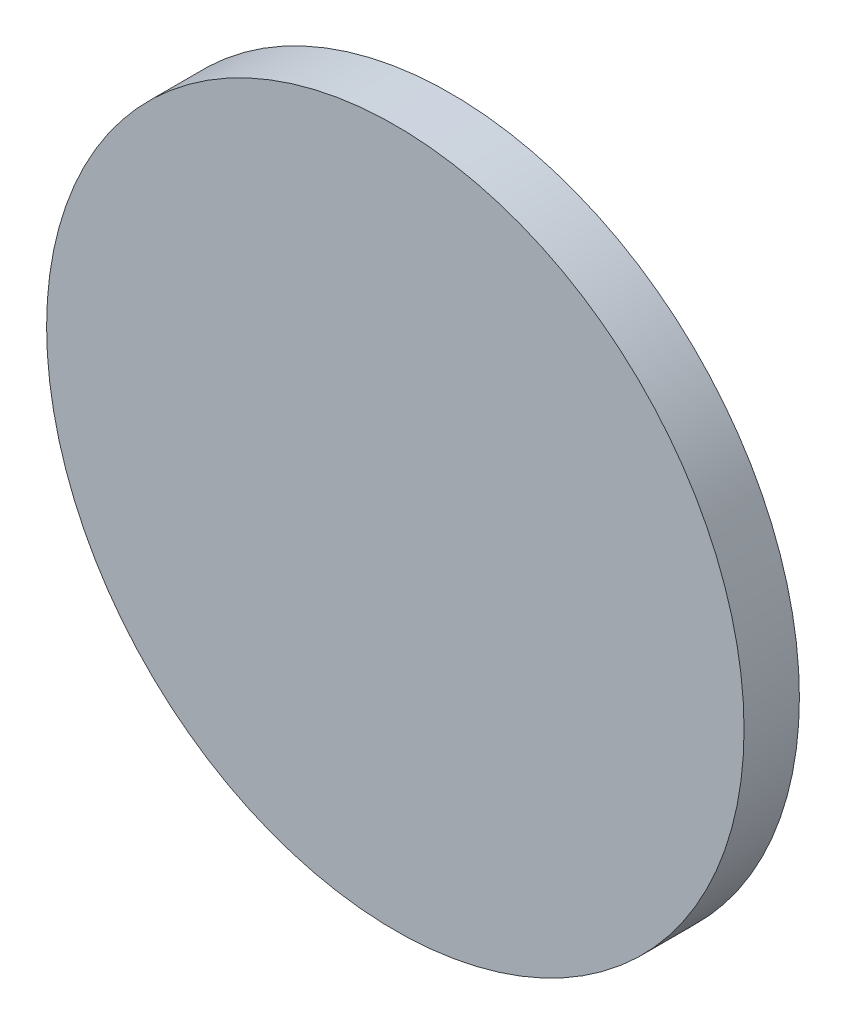
ISO-10303-21;
HEADER;
FILE_DESCRIPTION(('STEP AP214'),'2;1');
FILE_NAME('part.step','',(''),(''),'','','');
FILE_SCHEMA(('AUTOMOTIVE_DESIGN { 1 0 10303 214 1 1 1 1 }'));
ENDSEC;
DATA;
#1=APPLICATION_CONTEXT('core data for automotive mechanical design processes');
#2=APPLICATION_PROTOCOL_DEFINITION('international standard','automotive_design',2000,#1);
#3=PRODUCT_CONTEXT('',#1,'mechanical');
#4=PRODUCT('Part','Part','',(#3));
#5=PRODUCT_RELATED_PRODUCT_CATEGORY('part','',(#4));
#6=PRODUCT_DEFINITION_FORMATION('','',#4);
#7=PRODUCT_DEFINITION_CONTEXT('part definition',#1,'design');
#8=PRODUCT_DEFINITION('design','',#6,#7);
#9=PRODUCT_DEFINITION_SHAPE('','',#8);
#10=(LENGTH_UNIT() NAMED_UNIT(*) SI_UNIT(.MILLI.,.METRE.));
#11=(NAMED_UNIT(*) PLANE_ANGLE_UNIT() SI_UNIT($,.RADIAN.));
#12=(NAMED_UNIT(*) SI_UNIT($,.STERADIAN.) SOLID_ANGLE_UNIT());
#13=UNCERTAINTY_MEASURE_WITH_UNIT(LENGTH_MEASURE(1.E-05),#10,'distance_accuracy_value','');
#14=(GEOMETRIC_REPRESENTATION_CONTEXT(3) GLOBAL_UNCERTAINTY_ASSIGNED_CONTEXT((#13)) GLOBAL_UNIT_ASSIGNED_CONTEXT((#10,
#11,#12)) REPRESENTATION_CONTEXT('',''));
#15=CARTESIAN_POINT('',(0.,0.,0.));
#16=DIRECTION('',(0.,0.,1.));
#17=DIRECTION('',(1.,0.,0.));
#18=AXIS2_PLACEMENT_3D('',#15,#16,#17);
#19=CARTESIAN_POINT('',(-3.719,5.173,11.731));
#20=DIRECTION('',(0.,0.,-1.));
#21=DIRECTION('',(-1.,0.,0.));
#22=AXIS2_PLACEMENT_3D('',#19,#20,#21);
#23=CYLINDRICAL_SURFACE('',#22,73.913);
#24=CARTESIAN_POINT('',(-3.719,5.173,11.731));
#25=DIRECTION('',(0.,0.,1.));
#26=DIRECTION('',(1.,0.,0.));
#27=AXIS2_PLACEMENT_3D('',#24,#25,#26);
#28=CIRCLE('',#27,73.913);
#29=CARTESIAN_POINT('',(70.194,5.173,11.731));
#30=VERTEX_POINT('',#29);
#31=EDGE_CURVE('E10',#30,#30,#28,.T.);
#32=ORIENTED_EDGE('',*,*,#31,.F.);
#33=EDGE_LOOP('',(#32));
#34=FACE_BOUND('',#33,.T.);
#35=CARTESIAN_POINT('',(-3.719,5.173,0.));
#36=DIRECTION('',(0.,0.,1.));
#37=DIRECTION('',(1.,0.,0.));
#38=AXIS2_PLACEMENT_3D('',#35,#36,#37);
#39=CIRCLE('',#38,73.913);
#40=CARTESIAN_POINT('',(70.194,5.173,0.));
#41=VERTEX_POINT('',#40);
#42=EDGE_CURVE('E45',#41,#41,#39,.T.);
#43=ORIENTED_EDGE('',*,*,#42,.T.);
#44=EDGE_LOOP('',(#43));
#45=FACE_BOUND('',#44,.T.);
#46=ADVANCED_FACE('F39',(#34,#45),#23,.T.);
#47=CARTESIAN_POINT('',(-3.719,5.173,11.731));
#48=DIRECTION('',(0.,0.,1.));
#49=DIRECTION('',(1.,0.,0.));
#50=AXIS2_PLACEMENT_3D('',#47,#48,#49);
#51=PLANE('',#50);
#52=ORIENTED_EDGE('',*,*,#31,.T.);
#53=EDGE_LOOP('',(#52));
#54=FACE_BOUND('',#53,.T.);
#55=ADVANCED_FACE('F53',(#54),#51,.T.);
#56=CARTESIAN_POINT('',(-3.719,5.173,0.));
#57=DIRECTION('',(0.,0.,1.));
#58=DIRECTION('',(1.,0.,0.));
#59=AXIS2_PLACEMENT_3D('',#56,#57,#58);
#60=PLANE('',#59);
#61=ORIENTED_EDGE('',*,*,#42,.F.);
#62=EDGE_LOOP('',(#61));
#63=FACE_BOUND('',#62,.T.);
#64=ADVANCED_FACE('F55',(#63),#60,.F.);
#65=CLOSED_SHELL('',(#46,#55,#64));
#66=MANIFOLD_SOLID_BREP('B2',#65);
#67=ADVANCED_BREP_SHAPE_REPRESENTATION('',(#18,#66),#14);
#68=SHAPE_DEFINITION_REPRESENTATION(#9,#67);
ENDSEC;
END-ISO-10303-21;
